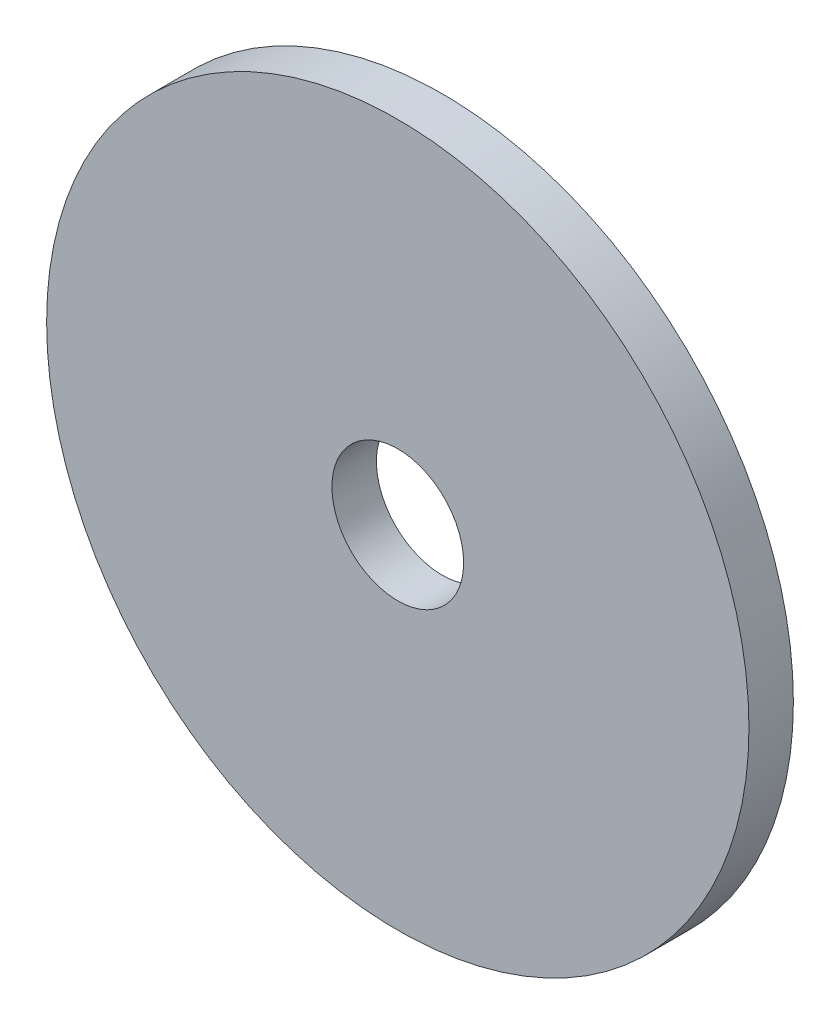
ISO-10303-21;
HEADER;
FILE_DESCRIPTION(('STEP AP214'),'2;1');
FILE_NAME('part.step','',(''),(''),'','','');
FILE_SCHEMA(('AUTOMOTIVE_DESIGN { 1 0 10303 214 1 1 1 1 }'));
ENDSEC;
DATA;
#1=APPLICATION_CONTEXT('core data for automotive mechanical design processes');
#2=APPLICATION_PROTOCOL_DEFINITION('international standard','automotive_design',2000,#1);
#3=PRODUCT_CONTEXT('',#1,'mechanical');
#4=PRODUCT('Part','Part','',(#3));
#5=PRODUCT_RELATED_PRODUCT_CATEGORY('part','',(#4));
#6=PRODUCT_DEFINITION_FORMATION('','',#4);
#7=PRODUCT_DEFINITION_CONTEXT('part definition',#1,'design');
#8=PRODUCT_DEFINITION('design','',#6,#7);
#9=PRODUCT_DEFINITION_SHAPE('','',#8);
#10=(LENGTH_UNIT() NAMED_UNIT(*) SI_UNIT(.MILLI.,.METRE.));
#11=(NAMED_UNIT(*) PLANE_ANGLE_UNIT() SI_UNIT($,.RADIAN.));
#12=(NAMED_UNIT(*) SI_UNIT($,.STERADIAN.) SOLID_ANGLE_UNIT());
#13=UNCERTAINTY_MEASURE_WITH_UNIT(LENGTH_MEASURE(1.E-05),#10,'distance_accuracy_value','');
#14=(GEOMETRIC_REPRESENTATION_CONTEXT(3) GLOBAL_UNCERTAINTY_ASSIGNED_CONTEXT((#13)) GLOBAL_UNIT_ASSIGNED_CONTEXT((#10,
#11,#12)) REPRESENTATION_CONTEXT('',''));
#15=CARTESIAN_POINT('',(0.,0.,0.));
#16=DIRECTION('',(0.,0.,1.));
#17=DIRECTION('',(1.,0.,0.));
#18=AXIS2_PLACEMENT_3D('',#15,#16,#17);
#19=CARTESIAN_POINT('',(0.,0.,0.253));
#20=DIRECTION('',(0.,0.,1.));
#21=DIRECTION('',(1.,0.,0.));
#22=AXIS2_PLACEMENT_3D('',#19,#20,#21);
#23=PLANE('',#22);
#24=CARTESIAN_POINT('',(0.,0.,0.253));
#25=DIRECTION('',(0.,0.,1.));
#26=DIRECTION('',(1.,0.,0.));
#27=AXIS2_PLACEMENT_3D('',#24,#25,#26);
#28=CIRCLE('',#27,2.);
#29=CARTESIAN_POINT('',(2.,0.,0.253));
#30=VERTEX_POINT('',#29);
#31=EDGE_CURVE('E10',#30,#30,#28,.T.);
#32=ORIENTED_EDGE('',*,*,#31,.T.);
#33=EDGE_LOOP('',(#32));
#34=FACE_BOUND('',#33,.T.);
#35=CARTESIAN_POINT('',(0.,0.,0.253));
#36=DIRECTION('',(0.,0.,1.));
#37=DIRECTION('',(1.,0.,0.));
#38=AXIS2_PLACEMENT_3D('',#35,#36,#37);
#39=CIRCLE('',#38,0.375);
#40=CARTESIAN_POINT('',(0.375,0.,0.253));
#41=VERTEX_POINT('',#40);
#42=EDGE_CURVE('E50',#41,#41,#39,.T.);
#43=ORIENTED_EDGE('',*,*,#42,.F.);
#44=EDGE_LOOP('',(#43));
#45=FACE_BOUND('',#44,.T.);
#46=ADVANCED_FACE('F37',(#34,#45),#23,.T.);
#47=CARTESIAN_POINT('',(0.,0.,0.));
#48=DIRECTION('',(0.,0.,1.));
#49=DIRECTION('',(1.,0.,0.));
#50=AXIS2_PLACEMENT_3D('',#47,#48,#49);
#51=PLANE('',#50);
#52=CARTESIAN_POINT('',(0.,0.,0.));
#53=DIRECTION('',(0.,0.,1.));
#54=DIRECTION('',(1.,0.,0.));
#55=AXIS2_PLACEMENT_3D('',#52,#53,#54);
#56=CIRCLE('',#55,2.);
#57=CARTESIAN_POINT('',(2.,0.,0.));
#58=VERTEX_POINT('',#57);
#59=EDGE_CURVE('E41',#58,#58,#56,.T.);
#60=ORIENTED_EDGE('',*,*,#59,.F.);
#61=EDGE_LOOP('',(#60));
#62=FACE_BOUND('',#61,.T.);
#63=CARTESIAN_POINT('',(0.,0.,0.));
#64=DIRECTION('',(0.,0.,1.));
#65=DIRECTION('',(1.,0.,0.));
#66=AXIS2_PLACEMENT_3D('',#63,#64,#65);
#67=CIRCLE('',#66,0.375);
#68=CARTESIAN_POINT('',(0.375,0.,0.));
#69=VERTEX_POINT('',#68);
#70=EDGE_CURVE('E52',#69,#69,#67,.T.);
#71=ORIENTED_EDGE('',*,*,#70,.T.);
#72=EDGE_LOOP('',(#71));
#73=FACE_BOUND('',#72,.T.);
#74=ADVANCED_FACE('F64',(#62,#73),#51,.F.);
#75=CARTESIAN_POINT('',(0.,0.,0.253));
#76=DIRECTION('',(0.,0.,-1.));
#77=DIRECTION('',(-1.,0.,0.));
#78=AXIS2_PLACEMENT_3D('',#75,#76,#77);
#79=CYLINDRICAL_SURFACE('',#78,2.);
#80=ORIENTED_EDGE('',*,*,#31,.F.);
#81=EDGE_LOOP('',(#80));
#82=FACE_BOUND('',#81,.T.);
#83=ORIENTED_EDGE('',*,*,#59,.T.);
#84=EDGE_LOOP('',(#83));
#85=FACE_BOUND('',#84,.T.);
#86=ADVANCED_FACE('F39',(#82,#85),#79,.T.);
#87=CARTESIAN_POINT('',(0.,0.,0.253));
#88=DIRECTION('',(0.,0.,-1.));
#89=DIRECTION('',(-1.,0.,0.));
#90=AXIS2_PLACEMENT_3D('',#87,#88,#89);
#91=CYLINDRICAL_SURFACE('',#90,0.375);
#92=ORIENTED_EDGE('',*,*,#42,.T.);
#93=EDGE_LOOP('',(#92));
#94=FACE_BOUND('',#93,.T.);
#95=ORIENTED_EDGE('',*,*,#70,.F.);
#96=EDGE_LOOP('',(#95));
#97=FACE_BOUND('',#96,.T.);
#98=ADVANCED_FACE('F60',(#94,#97),#91,.F.);
#99=CLOSED_SHELL('',(#46,#74,#86,#98));
#100=MANIFOLD_SOLID_BREP('B2',#99);
#101=ADVANCED_BREP_SHAPE_REPRESENTATION('',(#18,#100),#14);
#102=SHAPE_DEFINITION_REPRESENTATION(#9,#101);
ENDSEC;
END-ISO-10303-21;
